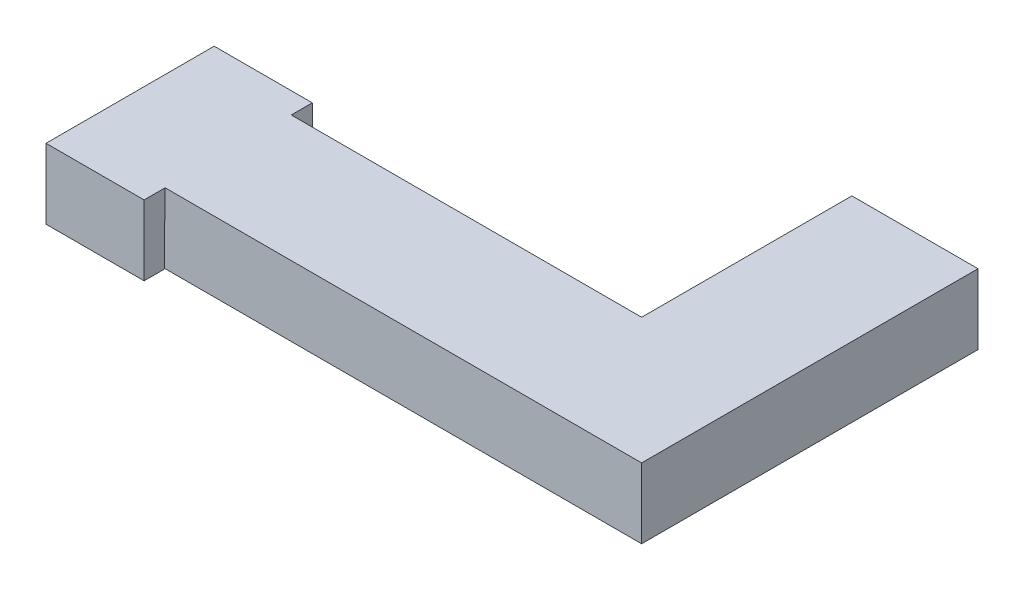
ISO-10303-21;
HEADER;
FILE_DESCRIPTION(('STEP AP214'),'2;1');
FILE_NAME('part.step','',(''),(''),'','','');
FILE_SCHEMA(('AUTOMOTIVE_DESIGN { 1 0 10303 214 1 1 1 1 }'));
ENDSEC;
DATA;
#1=APPLICATION_CONTEXT('core data for automotive mechanical design processes');
#2=APPLICATION_PROTOCOL_DEFINITION('international standard','automotive_design',2000,#1);
#3=PRODUCT_CONTEXT('',#1,'mechanical');
#4=PRODUCT('Part','Part','',(#3));
#5=PRODUCT_RELATED_PRODUCT_CATEGORY('part','',(#4));
#6=PRODUCT_DEFINITION_FORMATION('','',#4);
#7=PRODUCT_DEFINITION_CONTEXT('part definition',#1,'design');
#8=PRODUCT_DEFINITION('design','',#6,#7);
#9=PRODUCT_DEFINITION_SHAPE('','',#8);
#10=(LENGTH_UNIT() NAMED_UNIT(*) SI_UNIT(.MILLI.,.METRE.));
#11=(NAMED_UNIT(*) PLANE_ANGLE_UNIT() SI_UNIT($,.RADIAN.));
#12=(NAMED_UNIT(*) SI_UNIT($,.STERADIAN.) SOLID_ANGLE_UNIT());
#13=UNCERTAINTY_MEASURE_WITH_UNIT(LENGTH_MEASURE(1.E-05),#10,'distance_accuracy_value','');
#14=(GEOMETRIC_REPRESENTATION_CONTEXT(3) GLOBAL_UNCERTAINTY_ASSIGNED_CONTEXT((#13)) GLOBAL_UNIT_ASSIGNED_CONTEXT((#10,
#11,#12)) REPRESENTATION_CONTEXT('',''));
#15=CARTESIAN_POINT('',(0.,0.,0.));
#16=DIRECTION('',(0.,0.,1.));
#17=DIRECTION('',(1.,0.,0.));
#18=AXIS2_PLACEMENT_3D('',#15,#16,#17);
#19=CARTESIAN_POINT('',(12.5,2.,-19.5));
#20=DIRECTION('',(1.,0.,0.));
#21=DIRECTION('',(0.,0.,-1.));
#22=AXIS2_PLACEMENT_3D('',#19,#20,#21);
#23=PLANE('',#22);
#24=DIRECTION('',(0.,-1.,0.));
#25=VECTOR('',#24,1.);
#26=CARTESIAN_POINT('',(12.5,2.,-19.5));
#27=LINE('',#26,#25);
#28=CARTESIAN_POINT('',(12.5,2.,-19.5));
#29=VERTEX_POINT('',#28);
#30=CARTESIAN_POINT('',(12.5,-3.,-19.5));
#31=VERTEX_POINT('',#30);
#32=EDGE_CURVE('E592',#29,#31,#27,.T.);
#33=ORIENTED_EDGE('',*,*,#32,.T.);
#34=DIRECTION('',(0.,0.,1.));
#35=VECTOR('',#34,1.);
#36=CARTESIAN_POINT('',(12.5,-3.,-4.5));
#37=LINE('',#36,#35);
#38=CARTESIAN_POINT('',(12.5,-3.,-4.5));
#39=VERTEX_POINT('',#38);
#40=EDGE_CURVE('E529',#31,#39,#37,.T.);
#41=ORIENTED_EDGE('',*,*,#40,.T.);
#42=DIRECTION('',(0.,-1.,0.));
#43=VECTOR('',#42,1.);
#44=CARTESIAN_POINT('',(12.5,2.,-4.5));
#45=LINE('',#44,#43);
#46=CARTESIAN_POINT('',(12.5,2.,-4.5));
#47=VERTEX_POINT('',#46);
#48=EDGE_CURVE('E42',#47,#39,#45,.T.);
#49=ORIENTED_EDGE('',*,*,#48,.F.);
#50=DIRECTION('',(0.,0.,1.));
#51=VECTOR('',#50,1.);
#52=CARTESIAN_POINT('',(12.5,2.,-19.5));
#53=LINE('',#52,#51);
#54=EDGE_CURVE('E560',#29,#47,#53,.T.);
#55=ORIENTED_EDGE('',*,*,#54,.F.);
#56=EDGE_LOOP('',(#33,#41,#49,#55));
#57=FACE_BOUND('',#56,.T.);
#58=ADVANCED_FACE('F39',(#57),#23,.F.);
#59=CARTESIAN_POINT('',(-12.5,2.,-4.5));
#60=DIRECTION('',(0.,0.,1.));
#61=DIRECTION('',(1.,0.,0.));
#62=AXIS2_PLACEMENT_3D('',#59,#60,#61);
#63=PLANE('',#62);
#64=ORIENTED_EDGE('',*,*,#48,.T.);
#65=DIRECTION('',(-1.,0.,0.));
#66=VECTOR('',#65,1.);
#67=CARTESIAN_POINT('',(-13.1507184084655,-3.,-4.5));
#68=LINE('',#67,#66);
#69=CARTESIAN_POINT('',(-13.1507184084655,-3.,-4.5));
#70=VERTEX_POINT('',#69);
#71=EDGE_CURVE('E533',#39,#70,#68,.T.);
#72=ORIENTED_EDGE('',*,*,#71,.T.);
#73=DIRECTION('',(0.,1.,0.));
#74=VECTOR('',#73,1.);
#75=CARTESIAN_POINT('',(-13.1507184084655,-3.,-4.5));
#76=LINE('',#75,#74);
#77=CARTESIAN_POINT('',(-13.1507184084655,-1.,-4.5));
#78=VERTEX_POINT('',#77);
#79=EDGE_CURVE('E547',#70,#78,#76,.T.);
#80=ORIENTED_EDGE('',*,*,#79,.T.);
#81=CARTESIAN_POINT('',(-13.1507184084655,0.,-4.5));
#82=VERTEX_POINT('',#81);
#83=EDGE_CURVE('E60',#78,#82,#76,.T.);
#84=ORIENTED_EDGE('',*,*,#83,.T.);
#85=DIRECTION('',(-1.,0.,0.));
#86=VECTOR('',#85,1.);
#87=CARTESIAN_POINT('',(-13.1507184084655,0.,-4.5));
#88=LINE('',#87,#86);
#89=CARTESIAN_POINT('',(-12.5,0.,-4.5));
#90=VERTEX_POINT('',#89);
#91=EDGE_CURVE('E11',#90,#82,#88,.T.);
#92=ORIENTED_EDGE('',*,*,#91,.F.);
#93=DIRECTION('',(0.,-1.,0.));
#94=VECTOR('',#93,1.);
#95=CARTESIAN_POINT('',(-12.5,2.,-4.5));
#96=LINE('',#95,#94);
#97=CARTESIAN_POINT('',(-12.5,2.,-4.5));
#98=VERTEX_POINT('',#97);
#99=EDGE_CURVE('E630',#98,#90,#96,.T.);
#100=ORIENTED_EDGE('',*,*,#99,.F.);
#101=DIRECTION('',(-1.,0.,0.));
#102=VECTOR('',#101,1.);
#103=CARTESIAN_POINT('',(-12.5,2.,-4.5));
#104=LINE('',#103,#102);
#105=EDGE_CURVE('E564',#47,#98,#104,.T.);
#106=ORIENTED_EDGE('',*,*,#105,.F.);
#107=EDGE_LOOP('',(#64,#72,#80,#84,#92,#100,#106));
#108=FACE_BOUND('',#107,.T.);
#109=ADVANCED_FACE('F640',(#108),#63,.F.);
#110=CARTESIAN_POINT('',(-12.5,2.,-4.5));
#111=DIRECTION('',(-1.,0.,0.));
#112=DIRECTION('',(0.,0.,1.));
#113=AXIS2_PLACEMENT_3D('',#110,#111,#112);
#114=PLANE('',#113);
#115=DIRECTION('',(0.,0.,-1.));
#116=VECTOR('',#115,1.);
#117=CARTESIAN_POINT('',(-12.5,0.,-4.5));
#118=LINE('',#117,#116);
#119=CARTESIAN_POINT('',(-12.5,0.,-4.55));
#120=VERTEX_POINT('',#119);
#121=EDGE_CURVE('E550',#90,#120,#118,.T.);
#122=ORIENTED_EDGE('',*,*,#121,.T.);
#123=DIRECTION('',(0.,1.,0.));
#124=VECTOR('',#123,1.);
#125=CARTESIAN_POINT('',(-12.5,-3.,-4.55));
#126=LINE('',#125,#124);
#127=CARTESIAN_POINT('',(-12.5,-3.,-4.55));
#128=VERTEX_POINT('',#127);
#129=EDGE_CURVE('E507',#128,#120,#126,.T.);
#130=ORIENTED_EDGE('',*,*,#129,.F.);
#131=DIRECTION('',(0.,0.,-1.));
#132=VECTOR('',#131,1.);
#133=CARTESIAN_POINT('',(-12.5,-3.,-4.55));
#134=LINE('',#133,#132);
#135=CARTESIAN_POINT('',(-12.5,-3.,-6.));
#136=VERTEX_POINT('',#135);
#137=EDGE_CURVE('E490',#128,#136,#134,.T.);
#138=ORIENTED_EDGE('',*,*,#137,.T.);
#139=DIRECTION('',(0.,-1.,0.));
#140=VECTOR('',#139,1.);
#141=CARTESIAN_POINT('',(-12.5,2.,-6.));
#142=LINE('',#141,#140);
#143=CARTESIAN_POINT('',(-12.5,2.,-6.));
#144=VERTEX_POINT('',#143);
#145=EDGE_CURVE('E628',#144,#136,#142,.T.);
#146=ORIENTED_EDGE('',*,*,#145,.F.);
#147=DIRECTION('',(0.,0.,-1.));
#148=VECTOR('',#147,1.);
#149=CARTESIAN_POINT('',(-12.5,2.,-4.5));
#150=LINE('',#149,#148);
#151=EDGE_CURVE('E568',#98,#144,#150,.T.);
#152=ORIENTED_EDGE('',*,*,#151,.F.);
#153=ORIENTED_EDGE('',*,*,#99,.T.);
#154=EDGE_LOOP('',(#122,#130,#138,#146,#152,#153));
#155=FACE_BOUND('',#154,.T.);
#156=ADVANCED_FACE('F666',(#155),#114,.F.);
#157=CARTESIAN_POINT('',(-12.5,2.,-6.));
#158=DIRECTION('',(0.,0.,1.));
#159=DIRECTION('',(1.,0.,0.));
#160=AXIS2_PLACEMENT_3D('',#157,#158,#159);
#161=PLANE('',#160);
#162=ORIENTED_EDGE('',*,*,#145,.T.);
#163=DIRECTION('',(-1.,0.,0.));
#164=VECTOR('',#163,1.);
#165=CARTESIAN_POINT('',(-12.5,-3.,-6.));
#166=LINE('',#165,#164);
#167=CARTESIAN_POINT('',(-19.5,-3.,-6.));
#168=VERTEX_POINT('',#167);
#169=EDGE_CURVE('E494',#136,#168,#166,.T.);
#170=ORIENTED_EDGE('',*,*,#169,.T.);
#171=DIRECTION('',(0.,-1.,0.));
#172=VECTOR('',#171,1.);
#173=CARTESIAN_POINT('',(-19.5,2.,-6.));
#174=LINE('',#173,#172);
#175=CARTESIAN_POINT('',(-19.5,2.,-6.));
#176=VERTEX_POINT('',#175);
#177=EDGE_CURVE('E625',#176,#168,#174,.T.);
#178=ORIENTED_EDGE('',*,*,#177,.F.);
#179=DIRECTION('',(-1.,0.,0.));
#180=VECTOR('',#179,1.);
#181=CARTESIAN_POINT('',(-12.5,2.,-6.));
#182=LINE('',#181,#180);
#183=EDGE_CURVE('E571',#144,#176,#182,.T.);
#184=ORIENTED_EDGE('',*,*,#183,.F.);
#185=EDGE_LOOP('',(#162,#170,#178,#184));
#186=FACE_BOUND('',#185,.T.);
#187=ADVANCED_FACE('F672',(#186),#161,.F.);
#188=CARTESIAN_POINT('',(-19.5,2.,-6.));
#189=DIRECTION('',(1.,0.,0.));
#190=DIRECTION('',(0.,0.,-1.));
#191=AXIS2_PLACEMENT_3D('',#188,#189,#190);
#192=PLANE('',#191);
#193=ORIENTED_EDGE('',*,*,#177,.T.);
#194=DIRECTION('',(0.,0.,1.));
#195=VECTOR('',#194,1.);
#196=CARTESIAN_POINT('',(-19.5,-3.,-6.));
#197=LINE('',#196,#195);
#198=CARTESIAN_POINT('',(-19.5,-3.,-3.55));
#199=VERTEX_POINT('',#198);
#200=EDGE_CURVE('E273',#168,#199,#197,.T.);
#201=ORIENTED_EDGE('',*,*,#200,.T.);
#202=DIRECTION('',(0.,-1.,0.));
#203=VECTOR('',#202,1.);
#204=CARTESIAN_POINT('',(-19.5,-1.,-3.55));
#205=LINE('',#204,#203);
#206=CARTESIAN_POINT('',(-19.5,-1.,-3.55));
#207=VERTEX_POINT('',#206);
#208=EDGE_CURVE('E267',#207,#199,#205,.T.);
#209=ORIENTED_EDGE('',*,*,#208,.F.);
#210=DIRECTION('',(0.,0.,-1.));
#211=VECTOR('',#210,1.);
#212=CARTESIAN_POINT('',(-19.5,-1.,-3.55));
#213=LINE('',#212,#211);
#214=CARTESIAN_POINT('',(-19.5,-1.,-4.55));
#215=VERTEX_POINT('',#214);
#216=EDGE_CURVE('E270',#207,#215,#213,.T.);
#217=ORIENTED_EDGE('',*,*,#216,.T.);
#218=DIRECTION('',(0.,1.,0.));
#219=VECTOR('',#218,1.);
#220=CARTESIAN_POINT('',(-19.5,-3.,-4.55));
#221=LINE('',#220,#219);
#222=CARTESIAN_POINT('',(-19.5,0.,-4.55));
#223=VERTEX_POINT('',#222);
#224=EDGE_CURVE('E503',#215,#223,#221,.T.);
#225=ORIENTED_EDGE('',*,*,#224,.T.);
#226=DIRECTION('',(0.,0.,1.));
#227=VECTOR('',#226,1.);
#228=CARTESIAN_POINT('',(-19.5,0.,-6.));
#229=LINE('',#228,#227);
#230=CARTESIAN_POINT('',(-19.5,0.,4.55));
#231=VERTEX_POINT('',#230);
#232=EDGE_CURVE('E596',#223,#231,#229,.T.);
#233=ORIENTED_EDGE('',*,*,#232,.T.);
#234=DIRECTION('',(0.,1.,0.));
#235=VECTOR('',#234,1.);
#236=CARTESIAN_POINT('',(-19.5,-3.,4.55));
#237=LINE('',#236,#235);
#238=CARTESIAN_POINT('',(-19.5,-1.,4.55));
#239=VERTEX_POINT('',#238);
#240=EDGE_CURVE('E367',#239,#231,#237,.T.);
#241=ORIENTED_EDGE('',*,*,#240,.F.);
#242=DIRECTION('',(0.,0.,-1.));
#243=VECTOR('',#242,1.);
#244=CARTESIAN_POINT('',(-19.5,-1.,3.55));
#245=LINE('',#244,#243);
#246=CARTESIAN_POINT('',(-19.5,-1.,3.55));
#247=VERTEX_POINT('',#246);
#248=EDGE_CURVE('E320',#239,#247,#245,.T.);
#249=ORIENTED_EDGE('',*,*,#248,.T.);
#250=DIRECTION('',(0.,-1.,0.));
#251=VECTOR('',#250,1.);
#252=CARTESIAN_POINT('',(-19.5,-1.,3.55));
#253=LINE('',#252,#251);
#254=CARTESIAN_POINT('',(-19.5,-3.,3.55));
#255=VERTEX_POINT('',#254);
#256=EDGE_CURVE('E341',#247,#255,#253,.T.);
#257=ORIENTED_EDGE('',*,*,#256,.T.);
#258=DIRECTION('',(0.,0.,1.));
#259=VECTOR('',#258,1.);
#260=CARTESIAN_POINT('',(-19.5,-3.,4.55));
#261=LINE('',#260,#259);
#262=CARTESIAN_POINT('',(-19.5,-3.,6.));
#263=VERTEX_POINT('',#262);
#264=EDGE_CURVE('E355',#255,#263,#261,.T.);
#265=ORIENTED_EDGE('',*,*,#264,.T.);
#266=DIRECTION('',(0.,-1.,0.));
#267=VECTOR('',#266,1.);
#268=CARTESIAN_POINT('',(-19.5,2.,6.));
#269=LINE('',#268,#267);
#270=CARTESIAN_POINT('',(-19.5,2.,6.));
#271=VERTEX_POINT('',#270);
#272=EDGE_CURVE('E622',#271,#263,#269,.T.);
#273=ORIENTED_EDGE('',*,*,#272,.F.);
#274=DIRECTION('',(0.,0.,1.));
#275=VECTOR('',#274,1.);
#276=CARTESIAN_POINT('',(-19.5,2.,-6.));
#277=LINE('',#276,#275);
#278=EDGE_CURVE('E574',#176,#271,#277,.T.);
#279=ORIENTED_EDGE('',*,*,#278,.F.);
#280=EDGE_LOOP('',(#193,#201,#209,#217,#225,#233,#241,#249,#257,#265,#273,#279));
#281=FACE_BOUND('',#280,.T.);
#282=ADVANCED_FACE('F269',(#281),#192,.F.);
#283=CARTESIAN_POINT('',(-19.5,2.,6.));
#284=DIRECTION('',(0.,0.,-1.));
#285=DIRECTION('',(-1.,0.,0.));
#286=AXIS2_PLACEMENT_3D('',#283,#284,#285);
#287=PLANE('',#286);
#288=ORIENTED_EDGE('',*,*,#272,.T.);
#289=DIRECTION('',(1.,0.,0.));
#290=VECTOR('',#289,1.);
#291=CARTESIAN_POINT('',(-19.5,-3.,6.));
#292=LINE('',#291,#290);
#293=CARTESIAN_POINT('',(-12.5,-3.,6.));
#294=VERTEX_POINT('',#293);
#295=EDGE_CURVE('E359',#263,#294,#292,.T.);
#296=ORIENTED_EDGE('',*,*,#295,.T.);
#297=DIRECTION('',(0.,-1.,0.));
#298=VECTOR('',#297,1.);
#299=CARTESIAN_POINT('',(-12.5,2.,6.));
#300=LINE('',#299,#298);
#301=CARTESIAN_POINT('',(-12.5,2.,6.));
#302=VERTEX_POINT('',#301);
#303=EDGE_CURVE('E619',#302,#294,#300,.T.);
#304=ORIENTED_EDGE('',*,*,#303,.F.);
#305=DIRECTION('',(1.,0.,0.));
#306=VECTOR('',#305,1.);
#307=CARTESIAN_POINT('',(-19.5,2.,6.));
#308=LINE('',#307,#306);
#309=EDGE_CURVE('E577',#271,#302,#308,.T.);
#310=ORIENTED_EDGE('',*,*,#309,.F.);
#311=EDGE_LOOP('',(#288,#296,#304,#310));
#312=FACE_BOUND('',#311,.T.);
#313=ADVANCED_FACE('F723',(#312),#287,.F.);
#314=CARTESIAN_POINT('',(-12.5,2.,6.));
#315=DIRECTION('',(-1.,0.,0.));
#316=DIRECTION('',(0.,0.,1.));
#317=AXIS2_PLACEMENT_3D('',#314,#315,#316);
#318=PLANE('',#317);
#319=ORIENTED_EDGE('',*,*,#303,.T.);
#320=DIRECTION('',(0.,0.,-1.));
#321=VECTOR('',#320,1.);
#322=CARTESIAN_POINT('',(-12.5,-3.,6.));
#323=LINE('',#322,#321);
#324=CARTESIAN_POINT('',(-12.5,-3.,4.55));
#325=VERTEX_POINT('',#324);
#326=EDGE_CURVE('E348',#294,#325,#323,.T.);
#327=ORIENTED_EDGE('',*,*,#326,.T.);
#328=DIRECTION('',(0.,1.,0.));
#329=VECTOR('',#328,1.);
#330=CARTESIAN_POINT('',(-12.5,-3.,4.55));
#331=LINE('',#330,#329);
#332=CARTESIAN_POINT('',(-12.5,0.,4.55));
#333=VERTEX_POINT('',#332);
#334=EDGE_CURVE('E363',#325,#333,#331,.T.);
#335=ORIENTED_EDGE('',*,*,#334,.T.);
#336=DIRECTION('',(0.,0.,-1.));
#337=VECTOR('',#336,1.);
#338=CARTESIAN_POINT('',(-12.5,0.,6.));
#339=LINE('',#338,#337);
#340=CARTESIAN_POINT('',(-12.5,0.,4.5));
#341=VERTEX_POINT('',#340);
#342=EDGE_CURVE('E600',#333,#341,#339,.T.);
#343=ORIENTED_EDGE('',*,*,#342,.T.);
#344=DIRECTION('',(0.,-1.,0.));
#345=VECTOR('',#344,1.);
#346=CARTESIAN_POINT('',(-12.5,2.,4.5));
#347=LINE('',#346,#345);
#348=CARTESIAN_POINT('',(-12.5,2.,4.5));
#349=VERTEX_POINT('',#348);
#350=EDGE_CURVE('E615',#349,#341,#347,.T.);
#351=ORIENTED_EDGE('',*,*,#350,.F.);
#352=DIRECTION('',(0.,0.,-1.));
#353=VECTOR('',#352,1.);
#354=CARTESIAN_POINT('',(-12.5,2.,6.));
#355=LINE('',#354,#353);
#356=EDGE_CURVE('E580',#302,#349,#355,.T.);
#357=ORIENTED_EDGE('',*,*,#356,.F.);
#358=EDGE_LOOP('',(#319,#327,#335,#343,#351,#357));
#359=FACE_BOUND('',#358,.T.);
#360=ADVANCED_FACE('F717',(#359),#318,.F.);
#361=CARTESIAN_POINT('',(12.5,2.,4.5));
#362=DIRECTION('',(0.,0.,-1.));
#363=DIRECTION('',(-1.,0.,0.));
#364=AXIS2_PLACEMENT_3D('',#361,#362,#363);
#365=PLANE('',#364);
#366=ORIENTED_EDGE('',*,*,#350,.T.);
#367=DIRECTION('',(1.,0.,0.));
#368=VECTOR('',#367,1.);
#369=CARTESIAN_POINT('',(-13.1507184084655,0.,4.5));
#370=LINE('',#369,#368);
#371=CARTESIAN_POINT('',(-13.1507184084655,0.,4.5));
#372=VERTEX_POINT('',#371);
#373=EDGE_CURVE('E441',#372,#341,#370,.T.);
#374=ORIENTED_EDGE('',*,*,#373,.F.);
#375=DIRECTION('',(0.,1.,0.));
#376=VECTOR('',#375,1.);
#377=CARTESIAN_POINT('',(-13.1507184084655,-3.,4.5));
#378=LINE('',#377,#376);
#379=CARTESIAN_POINT('',(-13.1507184084655,-1.,4.5));
#380=VERTEX_POINT('',#379);
#381=EDGE_CURVE('E480',#380,#372,#378,.T.);
#382=ORIENTED_EDGE('',*,*,#381,.F.);
#383=CARTESIAN_POINT('',(-13.1507184084655,-3.,4.5));
#384=VERTEX_POINT('',#383);
#385=EDGE_CURVE('E475',#384,#380,#378,.T.);
#386=ORIENTED_EDGE('',*,*,#385,.F.);
#387=DIRECTION('',(1.,0.,0.));
#388=VECTOR('',#387,1.);
#389=CARTESIAN_POINT('',(-13.1507184084655,-3.,4.5));
#390=LINE('',#389,#388);
#391=CARTESIAN_POINT('',(21.5,-3.,4.5));
#392=VERTEX_POINT('',#391);
#393=EDGE_CURVE('E452',#384,#392,#390,.T.);
#394=ORIENTED_EDGE('',*,*,#393,.T.);
#395=DIRECTION('',(0.,-1.,0.));
#396=VECTOR('',#395,1.);
#397=CARTESIAN_POINT('',(21.5,2.,4.5));
#398=LINE('',#397,#396);
#399=CARTESIAN_POINT('',(21.5,2.,4.5));
#400=VERTEX_POINT('',#399);
#401=EDGE_CURVE('E612',#400,#392,#398,.T.);
#402=ORIENTED_EDGE('',*,*,#401,.F.);
#403=DIRECTION('',(1.,0.,0.));
#404=VECTOR('',#403,1.);
#405=CARTESIAN_POINT('',(-12.5,2.,4.5));
#406=LINE('',#405,#404);
#407=EDGE_CURVE('E583',#349,#400,#406,.T.);
#408=ORIENTED_EDGE('',*,*,#407,.F.);
#409=EDGE_LOOP('',(#366,#374,#382,#386,#394,#402,#408));
#410=FACE_BOUND('',#409,.T.);
#411=ADVANCED_FACE('F748',(#410),#365,.F.);
#412=CARTESIAN_POINT('',(21.5,2.,4.5));
#413=DIRECTION('',(-1.,0.,0.));
#414=DIRECTION('',(0.,0.,1.));
#415=AXIS2_PLACEMENT_3D('',#412,#413,#414);
#416=PLANE('',#415);
#417=ORIENTED_EDGE('',*,*,#401,.T.);
#418=DIRECTION('',(0.,0.,-1.));
#419=VECTOR('',#418,1.);
#420=CARTESIAN_POINT('',(21.5,-3.,4.5));
#421=LINE('',#420,#419);
#422=CARTESIAN_POINT('',(21.5,-3.,-19.5));
#423=VERTEX_POINT('',#422);
#424=EDGE_CURVE('E456',#392,#423,#421,.T.);
#425=ORIENTED_EDGE('',*,*,#424,.T.);
#426=DIRECTION('',(0.,-1.,0.));
#427=VECTOR('',#426,1.);
#428=CARTESIAN_POINT('',(21.5,2.,-19.5));
#429=LINE('',#428,#427);
#430=CARTESIAN_POINT('',(21.5,2.,-19.5));
#431=VERTEX_POINT('',#430);
#432=EDGE_CURVE('E609',#431,#423,#429,.T.);
#433=ORIENTED_EDGE('',*,*,#432,.F.);
#434=DIRECTION('',(0.,0.,-1.));
#435=VECTOR('',#434,1.);
#436=CARTESIAN_POINT('',(21.5,2.,4.5));
#437=LINE('',#436,#435);
#438=EDGE_CURVE('E586',#400,#431,#437,.T.);
#439=ORIENTED_EDGE('',*,*,#438,.F.);
#440=EDGE_LOOP('',(#417,#425,#433,#439));
#441=FACE_BOUND('',#440,.T.);
#442=ADVANCED_FACE('F744',(#441),#416,.F.);
#443=CARTESIAN_POINT('',(21.5,2.,-19.5));
#444=DIRECTION('',(0.,0.,1.));
#445=DIRECTION('',(1.,0.,0.));
#446=AXIS2_PLACEMENT_3D('',#443,#444,#445);
#447=PLANE('',#446);
#448=ORIENTED_EDGE('',*,*,#432,.T.);
#449=DIRECTION('',(-1.,0.,0.));
#450=VECTOR('',#449,1.);
#451=CARTESIAN_POINT('',(21.5,-3.,-19.5));
#452=LINE('',#451,#450);
#453=CARTESIAN_POINT('',(20.,-3.,-19.5));
#454=VERTEX_POINT('',#453);
#455=EDGE_CURVE('E436',#423,#454,#452,.T.);
#456=ORIENTED_EDGE('',*,*,#455,.T.);
#457=DIRECTION('',(0.,1.,0.));
#458=VECTOR('',#457,1.);
#459=CARTESIAN_POINT('',(20.,-3.,-19.5));
#460=LINE('',#459,#458);
#461=CARTESIAN_POINT('',(20.,0.,-19.5));
#462=VERTEX_POINT('',#461);
#463=EDGE_CURVE('E460',#454,#462,#460,.T.);
#464=ORIENTED_EDGE('',*,*,#463,.T.);
#465=DIRECTION('',(-1.,0.,0.));
#466=VECTOR('',#465,1.);
#467=CARTESIAN_POINT('',(21.5,0.,-19.5));
#468=LINE('',#467,#466);
#469=CARTESIAN_POINT('',(18.,0.,-19.5));
#470=VERTEX_POINT('',#469);
#471=EDGE_CURVE('E565',#462,#470,#468,.T.);
#472=ORIENTED_EDGE('',*,*,#471,.T.);
#473=DIRECTION('',(0.,1.,0.));
#474=VECTOR('',#473,1.);
#475=CARTESIAN_POINT('',(18.,-3.,-19.5));
#476=LINE('',#475,#474);
#477=CARTESIAN_POINT('',(18.,-3.,-19.5));
#478=VERTEX_POINT('',#477);
#479=EDGE_CURVE('E427',#478,#470,#476,.T.);
#480=ORIENTED_EDGE('',*,*,#479,.F.);
#481=DIRECTION('',(-1.,0.,0.));
#482=VECTOR('',#481,1.);
#483=CARTESIAN_POINT('',(16.,-3.,-19.5));
#484=LINE('',#483,#482);
#485=CARTESIAN_POINT('',(16.,-3.,-19.5));
#486=VERTEX_POINT('',#485);
#487=EDGE_CURVE('E386',#478,#486,#484,.T.);
#488=ORIENTED_EDGE('',*,*,#487,.T.);
#489=DIRECTION('',(0.,1.,0.));
#490=VECTOR('',#489,1.);
#491=CARTESIAN_POINT('',(16.,-3.,-19.5));
#492=LINE('',#491,#490);
#493=CARTESIAN_POINT('',(16.,0.,-19.5));
#494=VERTEX_POINT('',#493);
#495=EDGE_CURVE('E424',#486,#494,#492,.T.);
#496=ORIENTED_EDGE('',*,*,#495,.T.);
#497=CARTESIAN_POINT('',(14.,0.,-19.5));
#498=VERTEX_POINT('',#497);
#499=EDGE_CURVE('E603',#494,#498,#468,.T.);
#500=ORIENTED_EDGE('',*,*,#499,.T.);
#501=DIRECTION('',(0.,1.,0.));
#502=VECTOR('',#501,1.);
#503=CARTESIAN_POINT('',(14.,-3.,-19.5));
#504=LINE('',#503,#502);
#505=CARTESIAN_POINT('',(14.,-3.,-19.5));
#506=VERTEX_POINT('',#505);
#507=EDGE_CURVE('E551',#506,#498,#504,.T.);
#508=ORIENTED_EDGE('',*,*,#507,.F.);
#509=DIRECTION('',(-1.,0.,0.));
#510=VECTOR('',#509,1.);
#511=CARTESIAN_POINT('',(12.5,-3.,-19.5));
#512=LINE('',#511,#510);
#513=EDGE_CURVE('E525',#506,#31,#512,.T.);
#514=ORIENTED_EDGE('',*,*,#513,.T.);
#515=ORIENTED_EDGE('',*,*,#32,.F.);
#516=DIRECTION('',(-1.,0.,0.));
#517=VECTOR('',#516,1.);
#518=CARTESIAN_POINT('',(21.5,2.,-19.5));
#519=LINE('',#518,#517);
#520=EDGE_CURVE('E589',#431,#29,#519,.T.);
#521=ORIENTED_EDGE('',*,*,#520,.F.);
#522=EDGE_LOOP('',(#448,#456,#464,#472,#480,#488,#496,#500,#508,#514,#515,#521));
#523=FACE_BOUND('',#522,.T.);
#524=ADVANCED_FACE('F681',(#523),#447,.F.);
#525=CARTESIAN_POINT('',(0.,2.,0.));
#526=DIRECTION('',(0.,1.,0.));
#527=DIRECTION('',(0.,0.,1.));
#528=AXIS2_PLACEMENT_3D('',#525,#526,#527);
#529=PLANE('',#528);
#530=ORIENTED_EDGE('',*,*,#54,.T.);
#531=ORIENTED_EDGE('',*,*,#105,.T.);
#532=ORIENTED_EDGE('',*,*,#151,.T.);
#533=ORIENTED_EDGE('',*,*,#183,.T.);
#534=ORIENTED_EDGE('',*,*,#278,.T.);
#535=ORIENTED_EDGE('',*,*,#309,.T.);
#536=ORIENTED_EDGE('',*,*,#356,.T.);
#537=ORIENTED_EDGE('',*,*,#407,.T.);
#538=ORIENTED_EDGE('',*,*,#438,.T.);
#539=ORIENTED_EDGE('',*,*,#520,.T.);
#540=EDGE_LOOP('',(#530,#531,#532,#533,#534,#535,#536,#537,#538,#539));
#541=FACE_BOUND('',#540,.T.);
#542=ADVANCED_FACE('F676',(#541),#529,.T.);
#543=CARTESIAN_POINT('',(0.,0.,0.));
#544=DIRECTION('',(0.,1.,0.));
#545=DIRECTION('',(0.,0.,1.));
#546=AXIS2_PLACEMENT_3D('',#543,#544,#545);
#547=PLANE('',#546);
#548=ORIENTED_EDGE('',*,*,#342,.F.);
#549=DIRECTION('',(-1.,0.,0.));
#550=VECTOR('',#549,1.);
#551=CARTESIAN_POINT('',(-12.5,0.,4.55));
#552=LINE('',#551,#550);
#553=EDGE_CURVE('E340',#333,#231,#552,.T.);
#554=ORIENTED_EDGE('',*,*,#553,.T.);
#555=ORIENTED_EDGE('',*,*,#232,.F.);
#556=DIRECTION('',(1.,0.,0.));
#557=VECTOR('',#556,1.);
#558=CARTESIAN_POINT('',(-19.5,0.,-4.55));
#559=LINE('',#558,#557);
#560=EDGE_CURVE('E479',#223,#120,#559,.T.);
#561=ORIENTED_EDGE('',*,*,#560,.T.);
#562=ORIENTED_EDGE('',*,*,#121,.F.);
#563=ORIENTED_EDGE('',*,*,#91,.T.);
#564=DIRECTION('',(0.,0.,1.));
#565=VECTOR('',#564,1.);
#566=CARTESIAN_POINT('',(-13.1507184084655,0.,-3.));
#567=LINE('',#566,#565);
#568=CARTESIAN_POINT('',(-13.1507184084655,0.,-3.));
#569=VERTEX_POINT('',#568);
#570=EDGE_CURVE('E510',#82,#569,#567,.T.);
#571=ORIENTED_EDGE('',*,*,#570,.T.);
#572=DIRECTION('',(1.,0.,0.));
#573=VECTOR('',#572,1.);
#574=CARTESIAN_POINT('',(14.,0.,-3.));
#575=LINE('',#574,#573);
#576=CARTESIAN_POINT('',(14.,0.,-3.));
#577=VERTEX_POINT('',#576);
#578=EDGE_CURVE('E540',#569,#577,#575,.T.);
#579=ORIENTED_EDGE('',*,*,#578,.T.);
#580=DIRECTION('',(0.,0.,-1.));
#581=VECTOR('',#580,1.);
#582=CARTESIAN_POINT('',(14.,0.,-19.5));
#583=LINE('',#582,#581);
#584=EDGE_CURVE('E517',#577,#498,#583,.T.);
#585=ORIENTED_EDGE('',*,*,#584,.T.);
#586=ORIENTED_EDGE('',*,*,#499,.F.);
#587=DIRECTION('',(0.,0.,1.));
#588=VECTOR('',#587,1.);
#589=CARTESIAN_POINT('',(16.,0.,-1.));
#590=LINE('',#589,#588);
#591=CARTESIAN_POINT('',(16.,0.,-1.));
#592=VERTEX_POINT('',#591);
#593=EDGE_CURVE('E410',#494,#592,#590,.T.);
#594=ORIENTED_EDGE('',*,*,#593,.T.);
#595=DIRECTION('',(-1.,0.,0.));
#596=VECTOR('',#595,1.);
#597=CARTESIAN_POINT('',(-13.1507184084655,0.,-0.999999999999999));
#598=LINE('',#597,#596);
#599=CARTESIAN_POINT('',(-13.1507184084655,0.,-0.999999999999999));
#600=VERTEX_POINT('',#599);
#601=EDGE_CURVE('E378',#592,#600,#598,.T.);
#602=ORIENTED_EDGE('',*,*,#601,.T.);
#603=DIRECTION('',(0.,0.,1.));
#604=VECTOR('',#603,1.);
#605=CARTESIAN_POINT('',(-13.1507184084655,0.,1.));
#606=LINE('',#605,#604);
#607=CARTESIAN_POINT('',(-13.1507184084655,0.,1.));
#608=VERTEX_POINT('',#607);
#609=EDGE_CURVE('E370',#600,#608,#606,.T.);
#610=ORIENTED_EDGE('',*,*,#609,.T.);
#611=DIRECTION('',(1.,0.,0.));
#612=VECTOR('',#611,1.);
#613=CARTESIAN_POINT('',(18.,0.,0.999999999999996));
#614=LINE('',#613,#612);
#615=CARTESIAN_POINT('',(18.,0.,0.999999999999996));
#616=VERTEX_POINT('',#615);
#617=EDGE_CURVE('E402',#608,#616,#614,.T.);
#618=ORIENTED_EDGE('',*,*,#617,.T.);
#619=DIRECTION('',(0.,0.,-1.));
#620=VECTOR('',#619,1.);
#621=CARTESIAN_POINT('',(18.,0.,-19.5));
#622=LINE('',#621,#620);
#623=EDGE_CURVE('E406',#616,#470,#622,.T.);
#624=ORIENTED_EDGE('',*,*,#623,.T.);
#625=ORIENTED_EDGE('',*,*,#471,.F.);
#626=DIRECTION('',(0.,0.,1.));
#627=VECTOR('',#626,1.);
#628=CARTESIAN_POINT('',(20.,0.,-19.5));
#629=LINE('',#628,#627);
#630=CARTESIAN_POINT('',(20.,0.,3.));
#631=VERTEX_POINT('',#630);
#632=EDGE_CURVE('E420',#462,#631,#629,.T.);
#633=ORIENTED_EDGE('',*,*,#632,.T.);
#634=DIRECTION('',(-1.,0.,0.));
#635=VECTOR('',#634,1.);
#636=CARTESIAN_POINT('',(20.,0.,3.));
#637=LINE('',#636,#635);
#638=CARTESIAN_POINT('',(-13.1507184084655,0.,3.));
#639=VERTEX_POINT('',#638);
#640=EDGE_CURVE('E464',#631,#639,#637,.T.);
#641=ORIENTED_EDGE('',*,*,#640,.T.);
#642=DIRECTION('',(0.,0.,1.));
#643=VECTOR('',#642,1.);
#644=CARTESIAN_POINT('',(-13.1507184084655,0.,3.));
#645=LINE('',#644,#643);
#646=EDGE_CURVE('E468',#639,#372,#645,.T.);
#647=ORIENTED_EDGE('',*,*,#646,.T.);
#648=ORIENTED_EDGE('',*,*,#373,.T.);
#649=EDGE_LOOP('',(#548,#554,#555,#561,#562,#563,#571,#579,#585,#586,#594,#602,#610,#618,#624,
#625,#633,#641,#647,#648));
#650=FACE_BOUND('',#649,.T.);
#651=ADVANCED_FACE('F662',(#650),#547,.F.);
#652=CARTESIAN_POINT('',(-13.1507184084655,-3.,-3.));
#653=DIRECTION('',(-1.,0.,0.));
#654=DIRECTION('',(0.,0.,1.));
#655=AXIS2_PLACEMENT_3D('',#652,#653,#654);
#656=PLANE('',#655);
#657=DIRECTION('',(0.,-1.,0.));
#658=VECTOR('',#657,1.);
#659=CARTESIAN_POINT('',(-13.1507184084655,-1.,-3.55));
#660=LINE('',#659,#658);
#661=CARTESIAN_POINT('',(-13.1507184084655,-1.,-3.55));
#662=VERTEX_POINT('',#661);
#663=CARTESIAN_POINT('',(-13.1507184084655,-3.,-3.55));
#664=VERTEX_POINT('',#663);
#665=EDGE_CURVE('E280',#662,#664,#660,.T.);
#666=ORIENTED_EDGE('',*,*,#665,.T.);
#667=DIRECTION('',(0.,0.,1.));
#668=VECTOR('',#667,1.);
#669=CARTESIAN_POINT('',(-13.1507184084655,-3.,-3.));
#670=LINE('',#669,#668);
#671=CARTESIAN_POINT('',(-13.1507184084655,-3.,-3.));
#672=VERTEX_POINT('',#671);
#673=EDGE_CURVE('E513',#664,#672,#670,.T.);
#674=ORIENTED_EDGE('',*,*,#673,.T.);
#675=DIRECTION('',(0.,1.,0.));
#676=VECTOR('',#675,1.);
#677=CARTESIAN_POINT('',(-13.1507184084655,-3.,-3.));
#678=LINE('',#677,#676);
#679=EDGE_CURVE('E536',#672,#569,#678,.T.);
#680=ORIENTED_EDGE('',*,*,#679,.T.);
#681=ORIENTED_EDGE('',*,*,#570,.F.);
#682=ORIENTED_EDGE('',*,*,#83,.F.);
#683=DIRECTION('',(0.,0.,1.));
#684=VECTOR('',#683,1.);
#685=CARTESIAN_POINT('',(-13.1507184084655,-1.,-3.55));
#686=LINE('',#685,#684);
#687=EDGE_CURVE('E55',#78,#662,#686,.T.);
#688=ORIENTED_EDGE('',*,*,#687,.T.);
#689=EDGE_LOOP('',(#666,#674,#680,#681,#682,#688));
#690=FACE_BOUND('',#689,.T.);
#691=ADVANCED_FACE('F657',(#690),#656,.T.);
#692=CARTESIAN_POINT('',(14.,-3.,-19.5));
#693=DIRECTION('',(1.,0.,0.));
#694=DIRECTION('',(0.,0.,-1.));
#695=AXIS2_PLACEMENT_3D('',#692,#693,#694);
#696=PLANE('',#695);
#697=ORIENTED_EDGE('',*,*,#584,.F.);
#698=DIRECTION('',(0.,1.,0.));
#699=VECTOR('',#698,1.);
#700=CARTESIAN_POINT('',(14.,-3.,-3.));
#701=LINE('',#700,#699);
#702=CARTESIAN_POINT('',(14.,-3.,-3.));
#703=VERTEX_POINT('',#702);
#704=EDGE_CURVE('E555',#703,#577,#701,.T.);
#705=ORIENTED_EDGE('',*,*,#704,.F.);
#706=DIRECTION('',(0.,0.,-1.));
#707=VECTOR('',#706,1.);
#708=CARTESIAN_POINT('',(14.,-3.,-19.5));
#709=LINE('',#708,#707);
#710=EDGE_CURVE('E521',#703,#506,#709,.T.);
#711=ORIENTED_EDGE('',*,*,#710,.T.);
#712=ORIENTED_EDGE('',*,*,#507,.T.);
#713=EDGE_LOOP('',(#697,#705,#711,#712));
#714=FACE_BOUND('',#713,.T.);
#715=ADVANCED_FACE('F686',(#714),#696,.T.);
#716=CARTESIAN_POINT('',(14.,-3.,-3.));
#717=DIRECTION('',(0.,0.,1.));
#718=DIRECTION('',(1.,0.,0.));
#719=AXIS2_PLACEMENT_3D('',#716,#717,#718);
#720=PLANE('',#719);
#721=ORIENTED_EDGE('',*,*,#578,.F.);
#722=ORIENTED_EDGE('',*,*,#679,.F.);
#723=DIRECTION('',(1.,0.,0.));
#724=VECTOR('',#723,1.);
#725=CARTESIAN_POINT('',(14.,-3.,-3.));
#726=LINE('',#725,#724);
#727=EDGE_CURVE('E516',#672,#703,#726,.T.);
#728=ORIENTED_EDGE('',*,*,#727,.T.);
#729=ORIENTED_EDGE('',*,*,#704,.T.);
#730=EDGE_LOOP('',(#721,#722,#728,#729));
#731=FACE_BOUND('',#730,.T.);
#732=ADVANCED_FACE('F688',(#731),#720,.T.);
#733=CARTESIAN_POINT('',(0.,-3.,0.));
#734=DIRECTION('',(0.,-1.,0.));
#735=DIRECTION('',(0.,0.,-1.));
#736=AXIS2_PLACEMENT_3D('',#733,#734,#735);
#737=PLANE('',#736);
#738=ORIENTED_EDGE('',*,*,#673,.F.);
#739=DIRECTION('',(-1.,0.,0.));
#740=VECTOR('',#739,1.);
#741=CARTESIAN_POINT('',(-13.1507184084655,-3.,-3.55));
#742=LINE('',#741,#740);
#743=EDGE_CURVE('E304',#664,#199,#742,.T.);
#744=ORIENTED_EDGE('',*,*,#743,.T.);
#745=ORIENTED_EDGE('',*,*,#200,.F.);
#746=ORIENTED_EDGE('',*,*,#169,.F.);
#747=ORIENTED_EDGE('',*,*,#137,.F.);
#748=DIRECTION('',(1.,0.,0.));
#749=VECTOR('',#748,1.);
#750=CARTESIAN_POINT('',(-19.5,-3.,-4.55));
#751=LINE('',#750,#749);
#752=CARTESIAN_POINT('',(-13.1507184084655,-3.,-4.55));
#753=VERTEX_POINT('',#752);
#754=EDGE_CURVE('E500',#753,#128,#751,.T.);
#755=ORIENTED_EDGE('',*,*,#754,.F.);
#756=DIRECTION('',(0.,0.,1.));
#757=VECTOR('',#756,1.);
#758=CARTESIAN_POINT('',(-13.1507184084655,-3.,-3.55));
#759=LINE('',#758,#757);
#760=EDGE_CURVE('E300',#753,#70,#759,.T.);
#761=ORIENTED_EDGE('',*,*,#760,.T.);
#762=ORIENTED_EDGE('',*,*,#71,.F.);
#763=ORIENTED_EDGE('',*,*,#40,.F.);
#764=ORIENTED_EDGE('',*,*,#513,.F.);
#765=ORIENTED_EDGE('',*,*,#710,.F.);
#766=ORIENTED_EDGE('',*,*,#727,.F.);
#767=EDGE_LOOP('',(#738,#744,#745,#746,#747,#755,#761,#762,#763,#764,#765,#766));
#768=FACE_BOUND('',#767,.T.);
#769=ADVANCED_FACE('F649',(#768),#737,.T.);
#770=CARTESIAN_POINT('',(-19.5,-3.,-4.55));
#771=DIRECTION('',(0.,0.,1.));
#772=DIRECTION('',(1.,0.,0.));
#773=AXIS2_PLACEMENT_3D('',#770,#771,#772);
#774=PLANE('',#773);
#775=DIRECTION('',(0.,-1.,0.));
#776=VECTOR('',#775,1.);
#777=CARTESIAN_POINT('',(-13.1507184084655,-1.,-4.55));
#778=LINE('',#777,#776);
#779=CARTESIAN_POINT('',(-13.1507184084655,-1.,-4.55));
#780=VERTEX_POINT('',#779);
#781=EDGE_CURVE('E279',#780,#753,#778,.T.);
#782=ORIENTED_EDGE('',*,*,#781,.T.);
#783=ORIENTED_EDGE('',*,*,#754,.T.);
#784=ORIENTED_EDGE('',*,*,#129,.T.);
#785=ORIENTED_EDGE('',*,*,#560,.F.);
#786=ORIENTED_EDGE('',*,*,#224,.F.);
#787=DIRECTION('',(1.,0.,0.));
#788=VECTOR('',#787,1.);
#789=CARTESIAN_POINT('',(-13.1507184084655,-1.,-4.55));
#790=LINE('',#789,#788);
#791=EDGE_CURVE('E287',#215,#780,#790,.T.);
#792=ORIENTED_EDGE('',*,*,#791,.T.);
#793=EDGE_LOOP('',(#782,#783,#784,#785,#786,#792));
#794=FACE_BOUND('',#793,.T.);
#795=ADVANCED_FACE('F942',(#794),#774,.T.);
#796=CARTESIAN_POINT('',(-13.1507184084655,-3.,3.));
#797=DIRECTION('',(-1.,0.,0.));
#798=DIRECTION('',(0.,0.,1.));
#799=AXIS2_PLACEMENT_3D('',#796,#797,#798);
#800=PLANE('',#799);
#801=DIRECTION('',(0.,-1.,0.));
#802=VECTOR('',#801,1.);
#803=CARTESIAN_POINT('',(-13.1507184084655,-1.,3.55));
#804=LINE('',#803,#802);
#805=CARTESIAN_POINT('',(-13.1507184084655,-1.,3.55));
#806=VERTEX_POINT('',#805);
#807=CARTESIAN_POINT('',(-13.1507184084655,-3.,3.55));
#808=VERTEX_POINT('',#807);
#809=EDGE_CURVE('E336',#806,#808,#804,.T.);
#810=ORIENTED_EDGE('',*,*,#809,.F.);
#811=DIRECTION('',(0.,0.,1.));
#812=VECTOR('',#811,1.);
#813=CARTESIAN_POINT('',(-13.1507184084655,-1.,3.55));
#814=LINE('',#813,#812);
#815=EDGE_CURVE('E313',#806,#380,#814,.T.);
#816=ORIENTED_EDGE('',*,*,#815,.T.);
#817=ORIENTED_EDGE('',*,*,#381,.T.);
#818=ORIENTED_EDGE('',*,*,#646,.F.);
#819=DIRECTION('',(0.,1.,0.));
#820=VECTOR('',#819,1.);
#821=CARTESIAN_POINT('',(-13.1507184084655,-3.,3.));
#822=LINE('',#821,#820);
#823=CARTESIAN_POINT('',(-13.1507184084655,-3.,3.));
#824=VERTEX_POINT('',#823);
#825=EDGE_CURVE('E481',#824,#639,#822,.T.);
#826=ORIENTED_EDGE('',*,*,#825,.F.);
#827=DIRECTION('',(0.,0.,1.));
#828=VECTOR('',#827,1.);
#829=CARTESIAN_POINT('',(-13.1507184084655,-3.,3.));
#830=LINE('',#829,#828);
#831=EDGE_CURVE('E449',#824,#808,#830,.T.);
#832=ORIENTED_EDGE('',*,*,#831,.T.);
#833=EDGE_LOOP('',(#810,#816,#817,#818,#826,#832));
#834=FACE_BOUND('',#833,.T.);
#835=ADVANCED_FACE('F730',(#834),#800,.T.);
#836=CARTESIAN_POINT('',(20.,-3.,3.));
#837=DIRECTION('',(0.,0.,-1.));
#838=DIRECTION('',(-1.,0.,0.));
#839=AXIS2_PLACEMENT_3D('',#836,#837,#838);
#840=PLANE('',#839);
#841=ORIENTED_EDGE('',*,*,#640,.F.);
#842=DIRECTION('',(0.,1.,0.));
#843=VECTOR('',#842,1.);
#844=CARTESIAN_POINT('',(20.,-3.,3.));
#845=LINE('',#844,#843);
#846=CARTESIAN_POINT('',(20.,-3.,3.));
#847=VERTEX_POINT('',#846);
#848=EDGE_CURVE('E484',#847,#631,#845,.T.);
#849=ORIENTED_EDGE('',*,*,#848,.F.);
#850=DIRECTION('',(-1.,0.,0.));
#851=VECTOR('',#850,1.);
#852=CARTESIAN_POINT('',(20.,-3.,3.));
#853=LINE('',#852,#851);
#854=EDGE_CURVE('E445',#847,#824,#853,.T.);
#855=ORIENTED_EDGE('',*,*,#854,.T.);
#856=ORIENTED_EDGE('',*,*,#825,.T.);
#857=EDGE_LOOP('',(#841,#849,#855,#856));
#858=FACE_BOUND('',#857,.T.);
#859=ADVANCED_FACE('F736',(#858),#840,.T.);
#860=CARTESIAN_POINT('',(20.,-3.,-19.5));
#861=DIRECTION('',(-1.,0.,0.));
#862=DIRECTION('',(0.,0.,1.));
#863=AXIS2_PLACEMENT_3D('',#860,#861,#862);
#864=PLANE('',#863);
#865=ORIENTED_EDGE('',*,*,#632,.F.);
#866=ORIENTED_EDGE('',*,*,#463,.F.);
#867=DIRECTION('',(0.,0.,1.));
#868=VECTOR('',#867,1.);
#869=CARTESIAN_POINT('',(20.,-3.,-19.5));
#870=LINE('',#869,#868);
#871=EDGE_CURVE('E440',#454,#847,#870,.T.);
#872=ORIENTED_EDGE('',*,*,#871,.T.);
#873=ORIENTED_EDGE('',*,*,#848,.T.);
#874=EDGE_LOOP('',(#865,#866,#872,#873));
#875=FACE_BOUND('',#874,.T.);
#876=ADVANCED_FACE('F739',(#875),#864,.T.);
#877=CARTESIAN_POINT('',(0.,-3.,0.));
#878=DIRECTION('',(0.,1.,0.));
#879=DIRECTION('',(0.,0.,1.));
#880=AXIS2_PLACEMENT_3D('',#877,#878,#879);
#881=PLANE('',#880);
#882=ORIENTED_EDGE('',*,*,#455,.F.);
#883=ORIENTED_EDGE('',*,*,#424,.F.);
#884=ORIENTED_EDGE('',*,*,#393,.F.);
#885=DIRECTION('',(0.,0.,1.));
#886=VECTOR('',#885,1.);
#887=CARTESIAN_POINT('',(-13.1507184084655,-3.,3.55));
#888=LINE('',#887,#886);
#889=CARTESIAN_POINT('',(-13.1507184084655,-3.,4.55));
#890=VERTEX_POINT('',#889);
#891=EDGE_CURVE('E309',#384,#890,#888,.T.);
#892=ORIENTED_EDGE('',*,*,#891,.T.);
#893=DIRECTION('',(-1.,0.,0.));
#894=VECTOR('',#893,1.);
#895=CARTESIAN_POINT('',(-12.5,-3.,4.55));
#896=LINE('',#895,#894);
#897=EDGE_CURVE('E352',#325,#890,#896,.T.);
#898=ORIENTED_EDGE('',*,*,#897,.F.);
#899=ORIENTED_EDGE('',*,*,#326,.F.);
#900=ORIENTED_EDGE('',*,*,#295,.F.);
#901=ORIENTED_EDGE('',*,*,#264,.F.);
#902=DIRECTION('',(1.,0.,0.));
#903=VECTOR('',#902,1.);
#904=CARTESIAN_POINT('',(-13.1507184084655,-3.,3.55));
#905=LINE('',#904,#903);
#906=EDGE_CURVE('E332',#255,#808,#905,.T.);
#907=ORIENTED_EDGE('',*,*,#906,.T.);
#908=ORIENTED_EDGE('',*,*,#831,.F.);
#909=ORIENTED_EDGE('',*,*,#854,.F.);
#910=ORIENTED_EDGE('',*,*,#871,.F.);
#911=EDGE_LOOP('',(#882,#883,#884,#892,#898,#899,#900,#901,#907,#908,#909,#910));
#912=FACE_BOUND('',#911,.T.);
#913=ADVANCED_FACE('F715',(#912),#881,.F.);
#914=CARTESIAN_POINT('',(-13.1507184084655,-3.,1.));
#915=DIRECTION('',(-1.,0.,0.));
#916=DIRECTION('',(0.,0.,1.));
#917=AXIS2_PLACEMENT_3D('',#914,#915,#916);
#918=PLANE('',#917);
#919=ORIENTED_EDGE('',*,*,#609,.F.);
#920=DIRECTION('',(0.,1.,0.));
#921=VECTOR('',#920,1.);
#922=CARTESIAN_POINT('',(-13.1507184084655,-3.,-0.999999999999999));
#923=LINE('',#922,#921);
#924=CARTESIAN_POINT('',(-13.1507184084655,-3.,-0.999999999999999));
#925=VERTEX_POINT('',#924);
#926=EDGE_CURVE('E417',#925,#600,#923,.T.);
#927=ORIENTED_EDGE('',*,*,#926,.F.);
#928=DIRECTION('',(0.,0.,1.));
#929=VECTOR('',#928,1.);
#930=CARTESIAN_POINT('',(-13.1507184084655,-3.,1.));
#931=LINE('',#930,#929);
#932=CARTESIAN_POINT('',(-13.1507184084655,-3.,1.));
#933=VERTEX_POINT('',#932);
#934=EDGE_CURVE('E373',#925,#933,#931,.T.);
#935=ORIENTED_EDGE('',*,*,#934,.T.);
#936=DIRECTION('',(0.,1.,0.));
#937=VECTOR('',#936,1.);
#938=CARTESIAN_POINT('',(-13.1507184084655,-3.,1.));
#939=LINE('',#938,#937);
#940=EDGE_CURVE('E398',#933,#608,#939,.T.);
#941=ORIENTED_EDGE('',*,*,#940,.T.);
#942=EDGE_LOOP('',(#919,#927,#935,#941));
#943=FACE_BOUND('',#942,.T.);
#944=ADVANCED_FACE('F856',(#943),#918,.T.);
#945=CARTESIAN_POINT('',(-13.1507184084655,-3.,-0.999999999999999));
#946=DIRECTION('',(0.,0.,-1.));
#947=DIRECTION('',(-1.,0.,0.));
#948=AXIS2_PLACEMENT_3D('',#945,#946,#947);
#949=PLANE('',#948);
#950=ORIENTED_EDGE('',*,*,#601,.F.);
#951=DIRECTION('',(0.,1.,0.));
#952=VECTOR('',#951,1.);
#953=CARTESIAN_POINT('',(16.,-3.,-1.));
#954=LINE('',#953,#952);
#955=CARTESIAN_POINT('',(16.,-3.,-1.));
#956=VERTEX_POINT('',#955);
#957=EDGE_CURVE('E421',#956,#592,#954,.T.);
#958=ORIENTED_EDGE('',*,*,#957,.F.);
#959=DIRECTION('',(-1.,0.,0.));
#960=VECTOR('',#959,1.);
#961=CARTESIAN_POINT('',(-13.1507184084655,-3.,-0.999999999999999));
#962=LINE('',#961,#960);
#963=EDGE_CURVE('E394',#956,#925,#962,.T.);
#964=ORIENTED_EDGE('',*,*,#963,.T.);
#965=ORIENTED_EDGE('',*,*,#926,.T.);
#966=EDGE_LOOP('',(#950,#958,#964,#965));
#967=FACE_BOUND('',#966,.T.);
#968=ADVANCED_FACE('F861',(#967),#949,.T.);
#969=CARTESIAN_POINT('',(16.,-3.,-1.));
#970=DIRECTION('',(-1.,0.,0.));
#971=DIRECTION('',(0.,0.,1.));
#972=AXIS2_PLACEMENT_3D('',#969,#970,#971);
#973=PLANE('',#972);
#974=ORIENTED_EDGE('',*,*,#593,.F.);
#975=ORIENTED_EDGE('',*,*,#495,.F.);
#976=DIRECTION('',(0.,0.,1.));
#977=VECTOR('',#976,1.);
#978=CARTESIAN_POINT('',(16.,-3.,-1.));
#979=LINE('',#978,#977);
#980=EDGE_CURVE('E390',#486,#956,#979,.T.);
#981=ORIENTED_EDGE('',*,*,#980,.T.);
#982=ORIENTED_EDGE('',*,*,#957,.T.);
#983=EDGE_LOOP('',(#974,#975,#981,#982));
#984=FACE_BOUND('',#983,.T.);
#985=ADVANCED_FACE('F871',(#984),#973,.T.);
#986=CARTESIAN_POINT('',(18.,-3.,-19.5));
#987=DIRECTION('',(1.,0.,0.));
#988=DIRECTION('',(0.,0.,-1.));
#989=AXIS2_PLACEMENT_3D('',#986,#987,#988);
#990=PLANE('',#989);
#991=ORIENTED_EDGE('',*,*,#623,.F.);
#992=DIRECTION('',(0.,1.,0.));
#993=VECTOR('',#992,1.);
#994=CARTESIAN_POINT('',(18.,-3.,0.999999999999996));
#995=LINE('',#994,#993);
#996=CARTESIAN_POINT('',(18.,-3.,0.999999999999996));
#997=VERTEX_POINT('',#996);
#998=EDGE_CURVE('E430',#997,#616,#995,.T.);
#999=ORIENTED_EDGE('',*,*,#998,.F.);
#1000=DIRECTION('',(0.,0.,-1.));
#1001=VECTOR('',#1000,1.);
#1002=CARTESIAN_POINT('',(18.,-3.,-19.5));
#1003=LINE('',#1002,#1001);
#1004=EDGE_CURVE('E382',#997,#478,#1003,.T.);
#1005=ORIENTED_EDGE('',*,*,#1004,.T.);
#1006=ORIENTED_EDGE('',*,*,#479,.T.);
#1007=EDGE_LOOP('',(#991,#999,#1005,#1006));
#1008=FACE_BOUND('',#1007,.T.);
#1009=ADVANCED_FACE('F881',(#1008),#990,.T.);
#1010=CARTESIAN_POINT('',(18.,-3.,0.999999999999996));
#1011=DIRECTION('',(0.,0.,1.));
#1012=DIRECTION('',(1.,0.,0.));
#1013=AXIS2_PLACEMENT_3D('',#1010,#1011,#1012);
#1014=PLANE('',#1013);
#1015=ORIENTED_EDGE('',*,*,#617,.F.);
#1016=ORIENTED_EDGE('',*,*,#940,.F.);
#1017=DIRECTION('',(1.,0.,0.));
#1018=VECTOR('',#1017,1.);
#1019=CARTESIAN_POINT('',(18.,-3.,0.999999999999996));
#1020=LINE('',#1019,#1018);
#1021=EDGE_CURVE('E377',#933,#997,#1020,.T.);
#1022=ORIENTED_EDGE('',*,*,#1021,.T.);
#1023=ORIENTED_EDGE('',*,*,#998,.T.);
#1024=EDGE_LOOP('',(#1015,#1016,#1022,#1023));
#1025=FACE_BOUND('',#1024,.T.);
#1026=ADVANCED_FACE('F891',(#1025),#1014,.T.);
#1027=CARTESIAN_POINT('',(0.,-3.,0.));
#1028=DIRECTION('',(0.,-1.,0.));
#1029=DIRECTION('',(0.,0.,-1.));
#1030=AXIS2_PLACEMENT_3D('',#1027,#1028,#1029);
#1031=PLANE('',#1030);
#1032=ORIENTED_EDGE('',*,*,#934,.F.);
#1033=ORIENTED_EDGE('',*,*,#963,.F.);
#1034=ORIENTED_EDGE('',*,*,#980,.F.);
#1035=ORIENTED_EDGE('',*,*,#487,.F.);
#1036=ORIENTED_EDGE('',*,*,#1004,.F.);
#1037=ORIENTED_EDGE('',*,*,#1021,.F.);
#1038=EDGE_LOOP('',(#1032,#1033,#1034,#1035,#1036,#1037));
#1039=FACE_BOUND('',#1038,.T.);
#1040=ADVANCED_FACE('F901',(#1039),#1031,.T.);
#1041=CARTESIAN_POINT('',(-12.5,-3.,4.55));
#1042=DIRECTION('',(0.,0.,-1.));
#1043=DIRECTION('',(-1.,0.,0.));
#1044=AXIS2_PLACEMENT_3D('',#1041,#1042,#1043);
#1045=PLANE('',#1044);
#1046=DIRECTION('',(0.,-1.,0.));
#1047=VECTOR('',#1046,1.);
#1048=CARTESIAN_POINT('',(-13.1507184084655,-1.,4.55));
#1049=LINE('',#1048,#1047);
#1050=CARTESIAN_POINT('',(-13.1507184084655,-1.,4.55));
#1051=VERTEX_POINT('',#1050);
#1052=EDGE_CURVE('E328',#1051,#890,#1049,.T.);
#1053=ORIENTED_EDGE('',*,*,#1052,.F.);
#1054=DIRECTION('',(-1.,0.,0.));
#1055=VECTOR('',#1054,1.);
#1056=CARTESIAN_POINT('',(-13.1507184084655,-1.,4.55));
#1057=LINE('',#1056,#1055);
#1058=EDGE_CURVE('E316',#1051,#239,#1057,.T.);
#1059=ORIENTED_EDGE('',*,*,#1058,.T.);
#1060=ORIENTED_EDGE('',*,*,#240,.T.);
#1061=ORIENTED_EDGE('',*,*,#553,.F.);
#1062=ORIENTED_EDGE('',*,*,#334,.F.);
#1063=ORIENTED_EDGE('',*,*,#897,.T.);
#1064=EDGE_LOOP('',(#1053,#1059,#1060,#1061,#1062,#1063));
#1065=FACE_BOUND('',#1064,.T.);
#1066=ADVANCED_FACE('F708',(#1065),#1045,.T.);
#1067=CARTESIAN_POINT('',(-13.1507184084655,-1.,3.55));
#1068=DIRECTION('',(1.,0.,0.));
#1069=DIRECTION('',(0.,0.,-1.));
#1070=AXIS2_PLACEMENT_3D('',#1067,#1068,#1069);
#1071=PLANE('',#1070);
#1072=ORIENTED_EDGE('',*,*,#385,.T.);
#1073=EDGE_CURVE('E317',#380,#1051,#814,.T.);
#1074=ORIENTED_EDGE('',*,*,#1073,.T.);
#1075=ORIENTED_EDGE('',*,*,#1052,.T.);
#1076=ORIENTED_EDGE('',*,*,#891,.F.);
#1077=EDGE_LOOP('',(#1072,#1074,#1075,#1076));
#1078=FACE_BOUND('',#1077,.T.);
#1079=ADVANCED_FACE('F698',(#1078),#1071,.T.);
#1080=CARTESIAN_POINT('',(-13.1507184084655,-1.,3.55));
#1081=DIRECTION('',(0.,0.,-1.));
#1082=DIRECTION('',(-1.,0.,0.));
#1083=AXIS2_PLACEMENT_3D('',#1080,#1081,#1082);
#1084=PLANE('',#1083);
#1085=ORIENTED_EDGE('',*,*,#906,.F.);
#1086=ORIENTED_EDGE('',*,*,#256,.F.);
#1087=DIRECTION('',(1.,0.,0.));
#1088=VECTOR('',#1087,1.);
#1089=CARTESIAN_POINT('',(-13.1507184084655,-1.,3.55));
#1090=LINE('',#1089,#1088);
#1091=EDGE_CURVE('E324',#247,#806,#1090,.T.);
#1092=ORIENTED_EDGE('',*,*,#1091,.T.);
#1093=ORIENTED_EDGE('',*,*,#809,.T.);
#1094=EDGE_LOOP('',(#1085,#1086,#1092,#1093));
#1095=FACE_BOUND('',#1094,.T.);
#1096=ADVANCED_FACE('F728',(#1095),#1084,.T.);
#1097=CARTESIAN_POINT('',(0.,-1.,0.));
#1098=DIRECTION('',(0.,-1.,0.));
#1099=DIRECTION('',(0.,0.,-1.));
#1100=AXIS2_PLACEMENT_3D('',#1097,#1098,#1099);
#1101=PLANE('',#1100);
#1102=ORIENTED_EDGE('',*,*,#815,.F.);
#1103=ORIENTED_EDGE('',*,*,#1091,.F.);
#1104=ORIENTED_EDGE('',*,*,#248,.F.);
#1105=ORIENTED_EDGE('',*,*,#1058,.F.);
#1106=ORIENTED_EDGE('',*,*,#1073,.F.);
#1107=EDGE_LOOP('',(#1102,#1103,#1104,#1105,#1106));
#1108=FACE_BOUND('',#1107,.T.);
#1109=ADVANCED_FACE('F704',(#1108),#1101,.F.);
#1110=CARTESIAN_POINT('',(-13.1507184084655,-1.,-3.55));
#1111=DIRECTION('',(1.,0.,0.));
#1112=DIRECTION('',(0.,0.,-1.));
#1113=AXIS2_PLACEMENT_3D('',#1110,#1111,#1112);
#1114=PLANE('',#1113);
#1115=ORIENTED_EDGE('',*,*,#79,.F.);
#1116=ORIENTED_EDGE('',*,*,#760,.F.);
#1117=ORIENTED_EDGE('',*,*,#781,.F.);
#1118=EDGE_CURVE('E292',#780,#78,#686,.T.);
#1119=ORIENTED_EDGE('',*,*,#1118,.T.);
#1120=EDGE_LOOP('',(#1115,#1116,#1117,#1119));
#1121=FACE_BOUND('',#1120,.T.);
#1122=ADVANCED_FACE('F654',(#1121),#1114,.T.);
#1123=CARTESIAN_POINT('',(-13.1507184084655,-1.,-3.55));
#1124=DIRECTION('',(0.,0.,1.));
#1125=DIRECTION('',(1.,0.,0.));
#1126=AXIS2_PLACEMENT_3D('',#1123,#1124,#1125);
#1127=PLANE('',#1126);
#1128=ORIENTED_EDGE('',*,*,#743,.F.);
#1129=ORIENTED_EDGE('',*,*,#665,.F.);
#1130=DIRECTION('',(-1.,0.,0.));
#1131=VECTOR('',#1130,1.);
#1132=CARTESIAN_POINT('',(-13.1507184084655,-1.,-3.55));
#1133=LINE('',#1132,#1131);
#1134=EDGE_CURVE('E286',#662,#207,#1133,.T.);
#1135=ORIENTED_EDGE('',*,*,#1134,.T.);
#1136=ORIENTED_EDGE('',*,*,#208,.T.);
#1137=EDGE_LOOP('',(#1128,#1129,#1135,#1136));
#1138=FACE_BOUND('',#1137,.T.);
#1139=ADVANCED_FACE('F290',(#1138),#1127,.T.);
#1140=CARTESIAN_POINT('',(0.,-1.,0.));
#1141=DIRECTION('',(0.,1.,0.));
#1142=DIRECTION('',(0.,0.,1.));
#1143=AXIS2_PLACEMENT_3D('',#1140,#1141,#1142);
#1144=PLANE('',#1143);
#1145=ORIENTED_EDGE('',*,*,#1118,.F.);
#1146=ORIENTED_EDGE('',*,*,#791,.F.);
#1147=ORIENTED_EDGE('',*,*,#216,.F.);
#1148=ORIENTED_EDGE('',*,*,#1134,.F.);
#1149=ORIENTED_EDGE('',*,*,#687,.F.);
#1150=EDGE_LOOP('',(#1145,#1146,#1147,#1148,#1149));
#1151=FACE_BOUND('',#1150,.T.);
#1152=ADVANCED_FACE('F285',(#1151),#1144,.T.);
#1153=CLOSED_SHELL('',(#58,#109,#156,#187,#282,#313,#360,#411,#442,#524,#542,#651,#691,#715,
#732,#769,#795,#835,#859,#876,#913,#944,#968,#985,#1009,#1026,#1040,#1066,#1079,#1096,#1109,
#1122,#1139,#1152));
#1154=MANIFOLD_SOLID_BREP('B2',#1153);
#1155=ADVANCED_BREP_SHAPE_REPRESENTATION('',(#18,#1154),#14);
#1156=SHAPE_DEFINITION_REPRESENTATION(#9,#1155);
ENDSEC;
END-ISO-10303-21;
